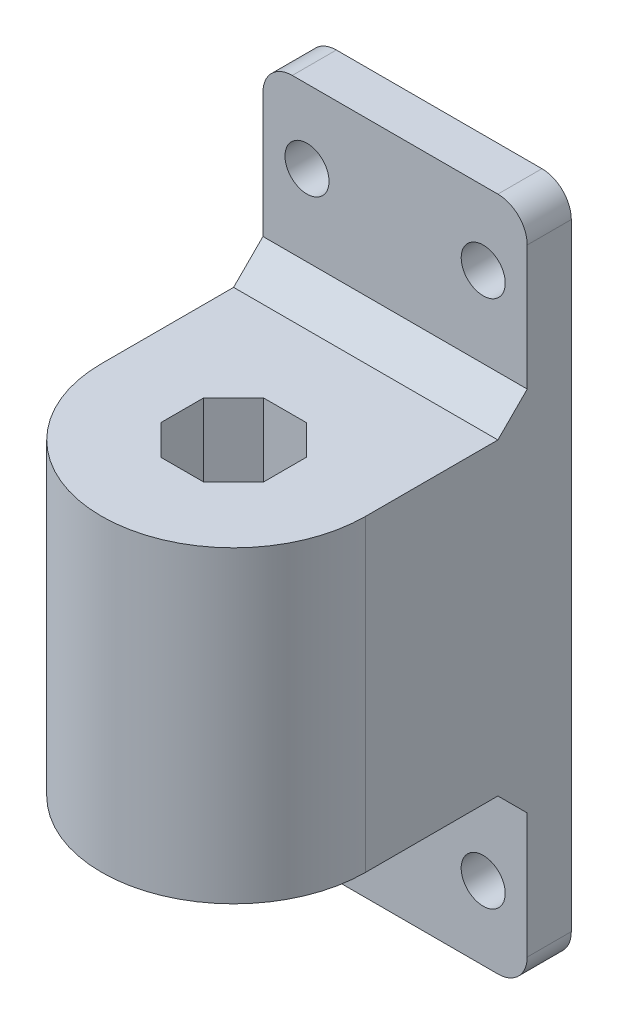
ISO-10303-21;
HEADER;
FILE_DESCRIPTION(('STEP AP214'),'2;1');
FILE_NAME('part.step','',(''),(''),'','','');
FILE_SCHEMA(('AUTOMOTIVE_DESIGN { 1 0 10303 214 1 1 1 1 }'));
ENDSEC;
DATA;
#1=APPLICATION_CONTEXT('core data for automotive mechanical design processes');
#2=APPLICATION_PROTOCOL_DEFINITION('international standard','automotive_design',2000,#1);
#3=PRODUCT_CONTEXT('',#1,'mechanical');
#4=PRODUCT('Part','Part','',(#3));
#5=PRODUCT_RELATED_PRODUCT_CATEGORY('part','',(#4));
#6=PRODUCT_DEFINITION_FORMATION('','',#4);
#7=PRODUCT_DEFINITION_CONTEXT('part definition',#1,'design');
#8=PRODUCT_DEFINITION('design','',#6,#7);
#9=PRODUCT_DEFINITION_SHAPE('','',#8);
#10=(LENGTH_UNIT() NAMED_UNIT(*) SI_UNIT(.MILLI.,.METRE.));
#11=(NAMED_UNIT(*) PLANE_ANGLE_UNIT() SI_UNIT($,.RADIAN.));
#12=(NAMED_UNIT(*) SI_UNIT($,.STERADIAN.) SOLID_ANGLE_UNIT());
#13=UNCERTAINTY_MEASURE_WITH_UNIT(LENGTH_MEASURE(1.E-05),#10,'distance_accuracy_value','');
#14=(GEOMETRIC_REPRESENTATION_CONTEXT(3) GLOBAL_UNCERTAINTY_ASSIGNED_CONTEXT((#13)) GLOBAL_UNIT_ASSIGNED_CONTEXT((#10,
#11,#12)) REPRESENTATION_CONTEXT('',''));
#15=CARTESIAN_POINT('',(0.,0.,0.));
#16=DIRECTION('',(0.,0.,1.));
#17=DIRECTION('',(1.,0.,0.));
#18=AXIS2_PLACEMENT_3D('',#15,#16,#17);
#19=CARTESIAN_POINT('',(0.,21.,14.));
#20=DIRECTION('',(0.,1.,0.));
#21=DIRECTION('',(0.,0.,1.));
#22=AXIS2_PLACEMENT_3D('',#19,#20,#21);
#23=PLANE('',#22);
#24=DIRECTION('',(-1.,0.,0.));
#25=VECTOR('',#24,1.);
#26=CARTESIAN_POINT('',(1.44974746830581,21.,10.5));
#27=LINE('',#26,#25);
#28=CARTESIAN_POINT('',(1.44974746830581,21.,10.5));
#29=VERTEX_POINT('',#28);
#30=CARTESIAN_POINT('',(-1.44974746830583,21.,10.5));
#31=VERTEX_POINT('',#30);
#32=EDGE_CURVE('E239',#29,#31,#27,.T.);
#33=ORIENTED_EDGE('',*,*,#32,.F.);
#34=DIRECTION('',(-0.707106781186552,0.,-0.707106781186543));
#35=VECTOR('',#34,1.);
#36=CARTESIAN_POINT('',(3.49999999999999,21.,12.5502525316942));
#37=LINE('',#36,#35);
#38=CARTESIAN_POINT('',(3.49999999999999,21.,12.5502525316942));
#39=VERTEX_POINT('',#38);
#40=EDGE_CURVE('E258',#39,#29,#37,.T.);
#41=ORIENTED_EDGE('',*,*,#40,.F.);
#42=DIRECTION('',(0.,0.,-1.));
#43=VECTOR('',#42,1.);
#44=CARTESIAN_POINT('',(3.5,21.,15.4497474683058));
#45=LINE('',#44,#43);
#46=CARTESIAN_POINT('',(3.5,21.,15.4497474683058));
#47=VERTEX_POINT('',#46);
#48=EDGE_CURVE('E255',#47,#39,#45,.T.);
#49=ORIENTED_EDGE('',*,*,#48,.F.);
#50=DIRECTION('',(0.707106781186546,0.,-0.707106781186549));
#51=VECTOR('',#50,1.);
#52=CARTESIAN_POINT('',(1.44974746830583,21.,17.5));
#53=LINE('',#52,#51);
#54=CARTESIAN_POINT('',(1.44974746830583,21.,17.5));
#55=VERTEX_POINT('',#54);
#56=EDGE_CURVE('E252',#55,#47,#53,.T.);
#57=ORIENTED_EDGE('',*,*,#56,.F.);
#58=DIRECTION('',(1.,0.,0.));
#59=VECTOR('',#58,1.);
#60=CARTESIAN_POINT('',(-1.44974746830584,21.,17.5));
#61=LINE('',#60,#59);
#62=CARTESIAN_POINT('',(-1.44974746830584,21.,17.5));
#63=VERTEX_POINT('',#62);
#64=EDGE_CURVE('E246',#63,#55,#61,.T.);
#65=ORIENTED_EDGE('',*,*,#64,.F.);
#66=DIRECTION('',(0.707106781186547,0.,0.707106781186548));
#67=VECTOR('',#66,1.);
#68=CARTESIAN_POINT('',(-3.5,21.,15.4497474683058));
#69=LINE('',#68,#67);
#70=CARTESIAN_POINT('',(-3.5,21.,15.4497474683058));
#71=VERTEX_POINT('',#70);
#72=EDGE_CURVE('E244',#71,#63,#69,.T.);
#73=ORIENTED_EDGE('',*,*,#72,.F.);
#74=DIRECTION('',(0.,0.,1.));
#75=VECTOR('',#74,1.);
#76=CARTESIAN_POINT('',(-3.5,21.,12.5502525316942));
#77=LINE('',#76,#75);
#78=CARTESIAN_POINT('',(-3.5,21.,12.5502525316942));
#79=VERTEX_POINT('',#78);
#80=EDGE_CURVE('E224',#79,#71,#77,.T.);
#81=ORIENTED_EDGE('',*,*,#80,.F.);
#82=DIRECTION('',(-0.707106781186547,0.,0.707106781186548));
#83=VECTOR('',#82,1.);
#84=CARTESIAN_POINT('',(-1.44974746830583,21.,10.5));
#85=LINE('',#84,#83);
#86=EDGE_CURVE('E233',#31,#79,#85,.T.);
#87=ORIENTED_EDGE('',*,*,#86,.F.);
#88=EDGE_LOOP('',(#33,#41,#49,#57,#65,#73,#81,#87));
#89=FACE_BOUND('',#88,.T.);
#90=DIRECTION('',(0.,0.,-1.));
#91=VECTOR('',#90,1.);
#92=CARTESIAN_POINT('',(9.,21.,14.));
#93=LINE('',#92,#91);
#94=CARTESIAN_POINT('',(9.,21.,14.));
#95=VERTEX_POINT('',#94);
#96=CARTESIAN_POINT('',(9.,21.,5.00000000000002));
#97=VERTEX_POINT('',#96);
#98=EDGE_CURVE('E327',#95,#97,#93,.T.);
#99=ORIENTED_EDGE('',*,*,#98,.T.);
#100=DIRECTION('',(-1.,0.,0.));
#101=VECTOR('',#100,1.);
#102=CARTESIAN_POINT('',(-9.,21.,5.00000000000002));
#103=LINE('',#102,#101);
#104=CARTESIAN_POINT('',(-9.,21.,5.00000000000002));
#105=VERTEX_POINT('',#104);
#106=EDGE_CURVE('E387',#97,#105,#103,.T.);
#107=ORIENTED_EDGE('',*,*,#106,.T.);
#108=DIRECTION('',(0.,0.,1.));
#109=VECTOR('',#108,1.);
#110=CARTESIAN_POINT('',(-9.,21.,0.));
#111=LINE('',#110,#109);
#112=CARTESIAN_POINT('',(-9.,21.,14.));
#113=VERTEX_POINT('',#112);
#114=EDGE_CURVE('E322',#105,#113,#111,.T.);
#115=ORIENTED_EDGE('',*,*,#114,.T.);
#116=CARTESIAN_POINT('',(0.,21.,14.));
#117=DIRECTION('',(0.,1.,0.));
#118=DIRECTION('',(0.,0.,1.));
#119=AXIS2_PLACEMENT_3D('',#116,#117,#118);
#120=CIRCLE('',#119,9.);
#121=EDGE_CURVE('E324',#113,#95,#120,.T.);
#122=ORIENTED_EDGE('',*,*,#121,.T.);
#123=EDGE_LOOP('',(#99,#107,#115,#122));
#124=FACE_BOUND('',#123,.T.);
#125=ADVANCED_FACE('F34',(#89,#124),#23,.T.);
#126=CARTESIAN_POINT('',(2.74241377865073,21.,9.24999999999999));
#127=DIRECTION('',(0.,0.,1.));
#128=DIRECTION('',(1.,0.,0.));
#129=AXIS2_PLACEMENT_3D('',#126,#127,#128);
#130=PLANE('',#129);
#131=DIRECTION('',(0.,-1.,0.));
#132=VECTOR('',#131,1.);
#133=CARTESIAN_POINT('',(2.74241377865073,21.,9.24999999999999));
#134=LINE('',#133,#132);
#135=CARTESIAN_POINT('',(2.74241377865073,4.00000000000001,9.24999999999999));
#136=VERTEX_POINT('',#135);
#137=CARTESIAN_POINT('',(2.74241377865072,0.,9.24999999999999));
#138=VERTEX_POINT('',#137);
#139=EDGE_CURVE('E309',#136,#138,#134,.T.);
#140=ORIENTED_EDGE('',*,*,#139,.F.);
#141=DIRECTION('',(-1.,0.,0.));
#142=VECTOR('',#141,1.);
#143=CARTESIAN_POINT('',(2.74241377865073,4.,9.24999999999999));
#144=LINE('',#143,#142);
#145=CARTESIAN_POINT('',(-2.74241377865072,4.,9.25));
#146=VERTEX_POINT('',#145);
#147=EDGE_CURVE('E288',#136,#146,#144,.T.);
#148=ORIENTED_EDGE('',*,*,#147,.T.);
#149=DIRECTION('',(0.,-1.,0.));
#150=VECTOR('',#149,1.);
#151=CARTESIAN_POINT('',(-2.74241377865072,21.,9.25));
#152=LINE('',#151,#150);
#153=CARTESIAN_POINT('',(-2.74241377865072,0.,9.25));
#154=VERTEX_POINT('',#153);
#155=EDGE_CURVE('E319',#146,#154,#152,.T.);
#156=ORIENTED_EDGE('',*,*,#155,.T.);
#157=DIRECTION('',(-1.,0.,0.));
#158=VECTOR('',#157,1.);
#159=CARTESIAN_POINT('',(2.74241377865073,0.,9.24999999999999));
#160=LINE('',#159,#158);
#161=EDGE_CURVE('E291',#138,#154,#160,.T.);
#162=ORIENTED_EDGE('',*,*,#161,.F.);
#163=EDGE_LOOP('',(#140,#148,#156,#162));
#164=FACE_BOUND('',#163,.T.);
#165=ADVANCED_FACE('F485',(#164),#130,.T.);
#166=CARTESIAN_POINT('',(-2.74241377865072,21.,9.25));
#167=DIRECTION('',(0.866025403784438,0.,0.5));
#168=DIRECTION('',(0.5,0.,-0.866025403784438));
#169=AXIS2_PLACEMENT_3D('',#166,#167,#168);
#170=PLANE('',#169);
#171=ORIENTED_EDGE('',*,*,#155,.F.);
#172=DIRECTION('',(-0.5,0.,0.866025403784438));
#173=VECTOR('',#172,1.);
#174=CARTESIAN_POINT('',(-2.74241377865072,4.,9.25));
#175=LINE('',#174,#173);
#176=CARTESIAN_POINT('',(-5.48482755730145,4.,14.));
#177=VERTEX_POINT('',#176);
#178=EDGE_CURVE('E285',#146,#177,#175,.T.);
#179=ORIENTED_EDGE('',*,*,#178,.T.);
#180=DIRECTION('',(0.,-1.,0.));
#181=VECTOR('',#180,1.);
#182=CARTESIAN_POINT('',(-5.48482755730145,21.,14.));
#183=LINE('',#182,#181);
#184=CARTESIAN_POINT('',(-5.48482755730145,0.,14.));
#185=VERTEX_POINT('',#184);
#186=EDGE_CURVE('E317',#177,#185,#183,.T.);
#187=ORIENTED_EDGE('',*,*,#186,.T.);
#188=DIRECTION('',(-0.5,0.,0.866025403784438));
#189=VECTOR('',#188,1.);
#190=CARTESIAN_POINT('',(-2.74241377865072,0.,9.25));
#191=LINE('',#190,#189);
#192=EDGE_CURVE('E294',#154,#185,#191,.T.);
#193=ORIENTED_EDGE('',*,*,#192,.F.);
#194=EDGE_LOOP('',(#171,#179,#187,#193));
#195=FACE_BOUND('',#194,.T.);
#196=ADVANCED_FACE('F490',(#195),#170,.T.);
#197=CARTESIAN_POINT('',(-5.48482755730145,21.,14.));
#198=DIRECTION('',(0.866025403784439,0.,-0.5));
#199=DIRECTION('',(-0.5,0.,-0.866025403784439));
#200=AXIS2_PLACEMENT_3D('',#197,#198,#199);
#201=PLANE('',#200);
#202=ORIENTED_EDGE('',*,*,#186,.F.);
#203=DIRECTION('',(0.5,0.,0.866025403784439));
#204=VECTOR('',#203,1.);
#205=CARTESIAN_POINT('',(-5.48482755730145,4.,14.));
#206=LINE('',#205,#204);
#207=CARTESIAN_POINT('',(-2.74241377865072,4.,18.75));
#208=VERTEX_POINT('',#207);
#209=EDGE_CURVE('E282',#177,#208,#206,.T.);
#210=ORIENTED_EDGE('',*,*,#209,.T.);
#211=DIRECTION('',(0.,-1.,0.));
#212=VECTOR('',#211,1.);
#213=CARTESIAN_POINT('',(-2.74241377865072,21.,18.75));
#214=LINE('',#213,#212);
#215=CARTESIAN_POINT('',(-2.74241377865072,0.,18.75));
#216=VERTEX_POINT('',#215);
#217=EDGE_CURVE('E315',#208,#216,#214,.T.);
#218=ORIENTED_EDGE('',*,*,#217,.T.);
#219=DIRECTION('',(0.5,0.,0.866025403784439));
#220=VECTOR('',#219,1.);
#221=CARTESIAN_POINT('',(-5.48482755730145,0.,14.));
#222=LINE('',#221,#220);
#223=EDGE_CURVE('E297',#185,#216,#222,.T.);
#224=ORIENTED_EDGE('',*,*,#223,.F.);
#225=EDGE_LOOP('',(#202,#210,#218,#224));
#226=FACE_BOUND('',#225,.T.);
#227=ADVANCED_FACE('F551',(#226),#201,.T.);
#228=CARTESIAN_POINT('',(-2.74241377865072,21.,18.75));
#229=DIRECTION('',(0.,0.,-1.));
#230=DIRECTION('',(-1.,0.,0.));
#231=AXIS2_PLACEMENT_3D('',#228,#229,#230);
#232=PLANE('',#231);
#233=ORIENTED_EDGE('',*,*,#217,.F.);
#234=DIRECTION('',(1.,0.,0.));
#235=VECTOR('',#234,1.);
#236=CARTESIAN_POINT('',(-2.74241377865072,4.,18.75));
#237=LINE('',#236,#235);
#238=CARTESIAN_POINT('',(2.74241377865073,4.,18.75));
#239=VERTEX_POINT('',#238);
#240=EDGE_CURVE('E279',#208,#239,#237,.T.);
#241=ORIENTED_EDGE('',*,*,#240,.T.);
#242=DIRECTION('',(0.,-1.,0.));
#243=VECTOR('',#242,1.);
#244=CARTESIAN_POINT('',(2.74241377865073,21.,18.75));
#245=LINE('',#244,#243);
#246=CARTESIAN_POINT('',(2.74241377865073,0.,18.75));
#247=VERTEX_POINT('',#246);
#248=EDGE_CURVE('E313',#239,#247,#245,.T.);
#249=ORIENTED_EDGE('',*,*,#248,.T.);
#250=DIRECTION('',(1.,0.,0.));
#251=VECTOR('',#250,1.);
#252=CARTESIAN_POINT('',(-2.74241377865072,0.,18.75));
#253=LINE('',#252,#251);
#254=EDGE_CURVE('E300',#216,#247,#253,.T.);
#255=ORIENTED_EDGE('',*,*,#254,.F.);
#256=EDGE_LOOP('',(#233,#241,#249,#255));
#257=FACE_BOUND('',#256,.T.);
#258=ADVANCED_FACE('F556',(#257),#232,.T.);
#259=CARTESIAN_POINT('',(2.74241377865073,21.,18.75));
#260=DIRECTION('',(-0.866025403784438,0.,-0.5));
#261=DIRECTION('',(-0.5,0.,0.866025403784439));
#262=AXIS2_PLACEMENT_3D('',#259,#260,#261);
#263=PLANE('',#262);
#264=ORIENTED_EDGE('',*,*,#248,.F.);
#265=DIRECTION('',(0.5,0.,-0.866025403784439));
#266=VECTOR('',#265,1.);
#267=CARTESIAN_POINT('',(2.74241377865073,4.,18.75));
#268=LINE('',#267,#266);
#269=CARTESIAN_POINT('',(5.48482755730145,4.,14.));
#270=VERTEX_POINT('',#269);
#271=EDGE_CURVE('E276',#239,#270,#268,.T.);
#272=ORIENTED_EDGE('',*,*,#271,.T.);
#273=DIRECTION('',(0.,-1.,0.));
#274=VECTOR('',#273,1.);
#275=CARTESIAN_POINT('',(5.48482755730145,21.,14.));
#276=LINE('',#275,#274);
#277=CARTESIAN_POINT('',(5.48482755730145,0.,14.));
#278=VERTEX_POINT('',#277);
#279=EDGE_CURVE('E311',#270,#278,#276,.T.);
#280=ORIENTED_EDGE('',*,*,#279,.T.);
#281=DIRECTION('',(0.5,0.,-0.866025403784438));
#282=VECTOR('',#281,1.);
#283=CARTESIAN_POINT('',(2.74241377865073,0.,18.75));
#284=LINE('',#283,#282);
#285=EDGE_CURVE('E303',#247,#278,#284,.T.);
#286=ORIENTED_EDGE('',*,*,#285,.F.);
#287=EDGE_LOOP('',(#264,#272,#280,#286));
#288=FACE_BOUND('',#287,.T.);
#289=ADVANCED_FACE('F559',(#288),#263,.T.);
#290=CARTESIAN_POINT('',(5.48482755730145,21.,14.));
#291=DIRECTION('',(-0.866025403784439,0.,0.5));
#292=DIRECTION('',(0.5,0.,0.866025403784439));
#293=AXIS2_PLACEMENT_3D('',#290,#291,#292);
#294=PLANE('',#293);
#295=ORIENTED_EDGE('',*,*,#279,.F.);
#296=DIRECTION('',(-0.5,0.,-0.866025403784439));
#297=VECTOR('',#296,1.);
#298=CARTESIAN_POINT('',(5.48482755730145,4.,14.));
#299=LINE('',#298,#297);
#300=EDGE_CURVE('E346',#270,#136,#299,.T.);
#301=ORIENTED_EDGE('',*,*,#300,.T.);
#302=ORIENTED_EDGE('',*,*,#139,.T.);
#303=DIRECTION('',(-0.5,0.,-0.866025403784439));
#304=VECTOR('',#303,1.);
#305=CARTESIAN_POINT('',(5.48482755730145,0.,14.));
#306=LINE('',#305,#304);
#307=EDGE_CURVE('E306',#278,#138,#306,.T.);
#308=ORIENTED_EDGE('',*,*,#307,.F.);
#309=EDGE_LOOP('',(#295,#301,#302,#308));
#310=FACE_BOUND('',#309,.T.);
#311=ADVANCED_FACE('F498',(#310),#294,.T.);
#312=CARTESIAN_POINT('',(0.,0.,14.));
#313=DIRECTION('',(0.,1.,0.));
#314=DIRECTION('',(0.,0.,1.));
#315=AXIS2_PLACEMENT_3D('',#312,#313,#314);
#316=PLANE('',#315);
#317=DIRECTION('',(0.,0.,1.));
#318=VECTOR('',#317,1.);
#319=CARTESIAN_POINT('',(-9.,0.,0.));
#320=LINE('',#319,#318);
#321=CARTESIAN_POINT('',(-9.,0.,5.00000000000002));
#322=VERTEX_POINT('',#321);
#323=CARTESIAN_POINT('',(-9.,0.,14.));
#324=VERTEX_POINT('',#323);
#325=EDGE_CURVE('E321',#322,#324,#320,.T.);
#326=ORIENTED_EDGE('',*,*,#325,.F.);
#327=DIRECTION('',(1.,0.,0.));
#328=VECTOR('',#327,1.);
#329=CARTESIAN_POINT('',(0.,0.,5.00000000000002));
#330=LINE('',#329,#328);
#331=CARTESIAN_POINT('',(9.,0.,5.00000000000002));
#332=VERTEX_POINT('',#331);
#333=EDGE_CURVE('E392',#322,#332,#330,.T.);
#334=ORIENTED_EDGE('',*,*,#333,.T.);
#335=DIRECTION('',(0.,0.,-1.));
#336=VECTOR('',#335,1.);
#337=CARTESIAN_POINT('',(9.,0.,14.));
#338=LINE('',#337,#336);
#339=CARTESIAN_POINT('',(9.,0.,14.));
#340=VERTEX_POINT('',#339);
#341=EDGE_CURVE('E325',#340,#332,#338,.T.);
#342=ORIENTED_EDGE('',*,*,#341,.F.);
#343=CARTESIAN_POINT('',(0.,0.,14.));
#344=DIRECTION('',(0.,1.,0.));
#345=DIRECTION('',(0.,0.,1.));
#346=AXIS2_PLACEMENT_3D('',#343,#344,#345);
#347=CIRCLE('',#346,9.);
#348=EDGE_CURVE('E332',#324,#340,#347,.T.);
#349=ORIENTED_EDGE('',*,*,#348,.F.);
#350=EDGE_LOOP('',(#326,#334,#342,#349));
#351=FACE_BOUND('',#350,.T.);
#352=ORIENTED_EDGE('',*,*,#161,.T.);
#353=ORIENTED_EDGE('',*,*,#192,.T.);
#354=ORIENTED_EDGE('',*,*,#223,.T.);
#355=ORIENTED_EDGE('',*,*,#254,.T.);
#356=ORIENTED_EDGE('',*,*,#285,.T.);
#357=ORIENTED_EDGE('',*,*,#307,.T.);
#358=EDGE_LOOP('',(#352,#353,#354,#355,#356,#357));
#359=FACE_BOUND('',#358,.T.);
#360=ADVANCED_FACE('F495',(#351,#359),#316,.F.);
#361=CARTESIAN_POINT('',(-9.,21.,0.));
#362=DIRECTION('',(1.,0.,0.));
#363=DIRECTION('',(0.,0.,-1.));
#364=AXIS2_PLACEMENT_3D('',#361,#362,#363);
#365=PLANE('',#364);
#366=DIRECTION('',(0.,-1.,0.));
#367=VECTOR('',#366,1.);
#368=CARTESIAN_POINT('',(-9.,21.,0.));
#369=LINE('',#368,#367);
#370=CARTESIAN_POINT('',(-9.,31.5,0.));
#371=VERTEX_POINT('',#370);
#372=CARTESIAN_POINT('',(-9.,-10.5,0.));
#373=VERTEX_POINT('',#372);
#374=EDGE_CURVE('E330',#371,#373,#369,.T.);
#375=ORIENTED_EDGE('',*,*,#374,.T.);
#376=DIRECTION('',(0.,0.,-1.));
#377=VECTOR('',#376,1.);
#378=CARTESIAN_POINT('',(-9.,-10.5,3.));
#379=LINE('',#378,#377);
#380=CARTESIAN_POINT('',(-9.,-10.5,3.));
#381=VERTEX_POINT('',#380);
#382=EDGE_CURVE('E375',#373,#381,#379,.F.);
#383=ORIENTED_EDGE('',*,*,#382,.T.);
#384=DIRECTION('',(0.,1.,0.));
#385=VECTOR('',#384,1.);
#386=CARTESIAN_POINT('',(-9.,0.,3.));
#387=LINE('',#386,#385);
#388=CARTESIAN_POINT('',(-9.,-1.99999999999999,3.));
#389=VERTEX_POINT('',#388);
#390=EDGE_CURVE('E538',#381,#389,#387,.T.);
#391=ORIENTED_EDGE('',*,*,#390,.T.);
#392=DIRECTION('',(0.,0.707106781186544,0.707106781186551));
#393=VECTOR('',#392,1.);
#394=CARTESIAN_POINT('',(-9.,7.99999999999988,13.));
#395=LINE('',#394,#393);
#396=EDGE_CURVE('E12',#389,#322,#395,.T.);
#397=ORIENTED_EDGE('',*,*,#396,.T.);
#398=ORIENTED_EDGE('',*,*,#325,.T.);
#399=DIRECTION('',(0.,-1.,0.));
#400=VECTOR('',#399,1.);
#401=CARTESIAN_POINT('',(-9.,21.,14.));
#402=LINE('',#401,#400);
#403=EDGE_CURVE('E343',#113,#324,#402,.T.);
#404=ORIENTED_EDGE('',*,*,#403,.F.);
#405=ORIENTED_EDGE('',*,*,#114,.F.);
#406=DIRECTION('',(0.,-0.707106781186542,0.707106781186553));
#407=VECTOR('',#406,1.);
#408=CARTESIAN_POINT('',(-9.,23.5,2.49999999999997));
#409=LINE('',#408,#407);
#410=CARTESIAN_POINT('',(-9.,23.,3.));
#411=VERTEX_POINT('',#410);
#412=EDGE_CURVE('E396',#105,#411,#409,.F.);
#413=ORIENTED_EDGE('',*,*,#412,.T.);
#414=DIRECTION('',(0.,1.,0.));
#415=VECTOR('',#414,1.);
#416=CARTESIAN_POINT('',(-9.,21.,3.));
#417=LINE('',#416,#415);
#418=CARTESIAN_POINT('',(-8.99999999999999,31.5,3.));
#419=VERTEX_POINT('',#418);
#420=EDGE_CURVE('E415',#411,#419,#417,.T.);
#421=ORIENTED_EDGE('',*,*,#420,.T.);
#422=DIRECTION('',(0.,0.,-1.));
#423=VECTOR('',#422,1.);
#424=CARTESIAN_POINT('',(-9.,31.5,0.));
#425=LINE('',#424,#423);
#426=EDGE_CURVE('E372',#419,#371,#425,.T.);
#427=ORIENTED_EDGE('',*,*,#426,.T.);
#428=EDGE_LOOP('',(#375,#383,#391,#397,#398,#404,#405,#413,#421,#427));
#429=FACE_BOUND('',#428,.T.);
#430=ADVANCED_FACE('F414',(#429),#365,.F.);
#431=CARTESIAN_POINT('',(0.,21.,14.));
#432=DIRECTION('',(0.,-1.,0.));
#433=DIRECTION('',(0.,0.,-1.));
#434=AXIS2_PLACEMENT_3D('',#431,#432,#433);
#435=CYLINDRICAL_SURFACE('',#434,9.);
#436=ORIENTED_EDGE('',*,*,#403,.T.);
#437=ORIENTED_EDGE('',*,*,#348,.T.);
#438=DIRECTION('',(0.,-1.,0.));
#439=VECTOR('',#438,1.);
#440=CARTESIAN_POINT('',(9.,21.,14.));
#441=LINE('',#440,#439);
#442=EDGE_CURVE('E341',#95,#340,#441,.T.);
#443=ORIENTED_EDGE('',*,*,#442,.F.);
#444=ORIENTED_EDGE('',*,*,#121,.F.);
#445=EDGE_LOOP('',(#436,#437,#443,#444));
#446=FACE_BOUND('',#445,.T.);
#447=ADVANCED_FACE('F506',(#446),#435,.T.);
#448=CARTESIAN_POINT('',(9.,21.,14.));
#449=DIRECTION('',(-1.,0.,0.));
#450=DIRECTION('',(0.,0.,1.));
#451=AXIS2_PLACEMENT_3D('',#448,#449,#450);
#452=PLANE('',#451);
#453=ORIENTED_EDGE('',*,*,#341,.T.);
#454=DIRECTION('',(0.,-0.707106781186544,-0.707106781186551));
#455=VECTOR('',#454,1.);
#456=CARTESIAN_POINT('',(9.,14.9999999999999,20.0000000000001));
#457=LINE('',#456,#455);
#458=CARTESIAN_POINT('',(9.,-1.99999999999999,3.));
#459=VERTEX_POINT('',#458);
#460=EDGE_CURVE('E42',#332,#459,#457,.T.);
#461=ORIENTED_EDGE('',*,*,#460,.T.);
#462=DIRECTION('',(0.,-1.,0.));
#463=VECTOR('',#462,1.);
#464=CARTESIAN_POINT('',(9.,0.,3.));
#465=LINE('',#464,#463);
#466=CARTESIAN_POINT('',(9.,-10.5,3.));
#467=VERTEX_POINT('',#466);
#468=EDGE_CURVE('E817',#459,#467,#465,.T.);
#469=ORIENTED_EDGE('',*,*,#468,.T.);
#470=DIRECTION('',(0.,0.,-1.));
#471=VECTOR('',#470,1.);
#472=CARTESIAN_POINT('',(9.,-10.5,0.));
#473=LINE('',#472,#471);
#474=CARTESIAN_POINT('',(9.,-10.5,0.));
#475=VERTEX_POINT('',#474);
#476=EDGE_CURVE('E351',#467,#475,#473,.T.);
#477=ORIENTED_EDGE('',*,*,#476,.T.);
#478=DIRECTION('',(0.,-1.,0.));
#479=VECTOR('',#478,1.);
#480=CARTESIAN_POINT('',(9.,21.,0.));
#481=LINE('',#480,#479);
#482=CARTESIAN_POINT('',(9.,31.5,0.));
#483=VERTEX_POINT('',#482);
#484=EDGE_CURVE('E338',#483,#475,#481,.T.);
#485=ORIENTED_EDGE('',*,*,#484,.F.);
#486=DIRECTION('',(0.,0.,-1.));
#487=VECTOR('',#486,1.);
#488=CARTESIAN_POINT('',(9.,31.5,3.));
#489=LINE('',#488,#487);
#490=CARTESIAN_POINT('',(9.,31.5,3.));
#491=VERTEX_POINT('',#490);
#492=EDGE_CURVE('E349',#483,#491,#489,.F.);
#493=ORIENTED_EDGE('',*,*,#492,.T.);
#494=DIRECTION('',(0.,-1.,0.));
#495=VECTOR('',#494,1.);
#496=CARTESIAN_POINT('',(9.,21.,3.));
#497=LINE('',#496,#495);
#498=CARTESIAN_POINT('',(9.,23.,3.));
#499=VERTEX_POINT('',#498);
#500=EDGE_CURVE('E404',#491,#499,#497,.T.);
#501=ORIENTED_EDGE('',*,*,#500,.T.);
#502=DIRECTION('',(0.,0.707106781186543,-0.707106781186553));
#503=VECTOR('',#502,1.);
#504=CARTESIAN_POINT('',(9.,16.5,9.50000000000007));
#505=LINE('',#504,#503);
#506=EDGE_CURVE('E398',#499,#97,#505,.F.);
#507=ORIENTED_EDGE('',*,*,#506,.T.);
#508=ORIENTED_EDGE('',*,*,#98,.F.);
#509=ORIENTED_EDGE('',*,*,#442,.T.);
#510=EDGE_LOOP('',(#453,#461,#469,#477,#485,#493,#501,#507,#508,#509));
#511=FACE_BOUND('',#510,.T.);
#512=ADVANCED_FACE('F402',(#511),#452,.F.);
#513=CARTESIAN_POINT('',(-9.,21.,0.));
#514=DIRECTION('',(0.,0.,1.));
#515=DIRECTION('',(1.,0.,0.));
#516=AXIS2_PLACEMENT_3D('',#513,#514,#515);
#517=PLANE('',#516);
#518=ORIENTED_EDGE('',*,*,#484,.T.);
#519=CARTESIAN_POINT('',(7.,-10.5,0.));
#520=DIRECTION('',(0.,0.,1.));
#521=DIRECTION('',(1.,0.,0.));
#522=AXIS2_PLACEMENT_3D('',#519,#520,#521);
#523=CIRCLE('',#522,2.);
#524=CARTESIAN_POINT('',(7.,-12.5,0.));
#525=VERTEX_POINT('',#524);
#526=EDGE_CURVE('E360',#475,#525,#523,.F.);
#527=ORIENTED_EDGE('',*,*,#526,.T.);
#528=DIRECTION('',(-1.,0.,0.));
#529=VECTOR('',#528,1.);
#530=CARTESIAN_POINT('',(9.,-12.5,0.));
#531=LINE('',#530,#529);
#532=CARTESIAN_POINT('',(-7.,-12.5,0.));
#533=VERTEX_POINT('',#532);
#534=EDGE_CURVE('E822',#525,#533,#531,.T.);
#535=ORIENTED_EDGE('',*,*,#534,.T.);
#536=CARTESIAN_POINT('',(-7.,-10.5,0.));
#537=DIRECTION('',(0.,0.,1.));
#538=DIRECTION('',(1.,0.,0.));
#539=AXIS2_PLACEMENT_3D('',#536,#537,#538);
#540=CIRCLE('',#539,2.);
#541=EDGE_CURVE('E358',#533,#373,#540,.F.);
#542=ORIENTED_EDGE('',*,*,#541,.T.);
#543=ORIENTED_EDGE('',*,*,#374,.F.);
#544=CARTESIAN_POINT('',(-7.,31.5,0.));
#545=DIRECTION('',(0.,0.,1.));
#546=DIRECTION('',(1.,0.,0.));
#547=AXIS2_PLACEMENT_3D('',#544,#545,#546);
#548=CIRCLE('',#547,2.);
#549=CARTESIAN_POINT('',(-7.,33.5,0.));
#550=VERTEX_POINT('',#549);
#551=EDGE_CURVE('E354',#371,#550,#548,.F.);
#552=ORIENTED_EDGE('',*,*,#551,.T.);
#553=DIRECTION('',(1.,0.,0.));
#554=VECTOR('',#553,1.);
#555=CARTESIAN_POINT('',(9.,33.5,0.));
#556=LINE('',#555,#554);
#557=CARTESIAN_POINT('',(7.,33.5,0.));
#558=VERTEX_POINT('',#557);
#559=EDGE_CURVE('E426',#550,#558,#556,.T.);
#560=ORIENTED_EDGE('',*,*,#559,.T.);
#561=CARTESIAN_POINT('',(7.,31.5,0.));
#562=DIRECTION('',(0.,0.,1.));
#563=DIRECTION('',(1.,0.,0.));
#564=AXIS2_PLACEMENT_3D('',#561,#562,#563);
#565=CIRCLE('',#564,2.);
#566=EDGE_CURVE('E356',#558,#483,#565,.F.);
#567=ORIENTED_EDGE('',*,*,#566,.T.);
#568=EDGE_LOOP('',(#518,#527,#535,#542,#543,#552,#560,#567));
#569=FACE_BOUND('',#568,.T.);
#570=CARTESIAN_POINT('',(-6.,28.5,0.));
#571=DIRECTION('',(0.,0.,-1.));
#572=DIRECTION('',(-1.,0.,0.));
#573=AXIS2_PLACEMENT_3D('',#570,#571,#572);
#574=CIRCLE('',#573,1.5);
#575=CARTESIAN_POINT('',(-7.49999999999999,28.5,0.));
#576=VERTEX_POINT('',#575);
#577=EDGE_CURVE('E832',#576,#576,#574,.T.);
#578=ORIENTED_EDGE('',*,*,#577,.F.);
#579=EDGE_LOOP('',(#578));
#580=FACE_BOUND('',#579,.T.);
#581=CARTESIAN_POINT('',(6.,28.5,0.));
#582=DIRECTION('',(0.,0.,-1.));
#583=DIRECTION('',(-1.,0.,0.));
#584=AXIS2_PLACEMENT_3D('',#581,#582,#583);
#585=CIRCLE('',#584,1.5);
#586=CARTESIAN_POINT('',(4.5,28.5,0.));
#587=VERTEX_POINT('',#586);
#588=EDGE_CURVE('E837',#587,#587,#585,.T.);
#589=ORIENTED_EDGE('',*,*,#588,.F.);
#590=EDGE_LOOP('',(#589));
#591=FACE_BOUND('',#590,.T.);
#592=CARTESIAN_POINT('',(6.,-7.49999999999999,0.));
#593=DIRECTION('',(0.,0.,-1.));
#594=DIRECTION('',(1.,0.,0.));
#595=AXIS2_PLACEMENT_3D('',#592,#593,#594);
#596=CIRCLE('',#595,1.5);
#597=CARTESIAN_POINT('',(7.5,-7.49999999999999,0.));
#598=VERTEX_POINT('',#597);
#599=EDGE_CURVE('E849',#598,#598,#596,.T.);
#600=ORIENTED_EDGE('',*,*,#599,.F.);
#601=EDGE_LOOP('',(#600));
#602=FACE_BOUND('',#601,.T.);
#603=CARTESIAN_POINT('',(-6.,-7.49999999999999,0.));
#604=DIRECTION('',(0.,0.,-1.));
#605=DIRECTION('',(1.,0.,0.));
#606=AXIS2_PLACEMENT_3D('',#603,#604,#605);
#607=CIRCLE('',#606,1.5);
#608=CARTESIAN_POINT('',(-4.5,-7.49999999999999,0.));
#609=VERTEX_POINT('',#608);
#610=EDGE_CURVE('E829',#609,#609,#607,.T.);
#611=ORIENTED_EDGE('',*,*,#610,.F.);
#612=EDGE_LOOP('',(#611));
#613=FACE_BOUND('',#612,.T.);
#614=ADVANCED_FACE('F500',(#569,#580,#591,#602,#613),#517,.F.);
#615=CARTESIAN_POINT('',(-1.44974746830583,-25.4558441227157,10.5));
#616=DIRECTION('',(-0.707106781186548,0.,-0.707106781186548));
#617=DIRECTION('',(-0.707106781186548,0.,0.707106781186548));
#618=AXIS2_PLACEMENT_3D('',#615,#616,#617);
#619=PLANE('',#618);
#620=DIRECTION('',(0.,1.,0.));
#621=VECTOR('',#620,1.);
#622=CARTESIAN_POINT('',(-3.5,-25.4558441227157,12.5502525316942));
#623=LINE('',#622,#621);
#624=CARTESIAN_POINT('',(-3.5,4.,12.5502525316942));
#625=VERTEX_POINT('',#624);
#626=EDGE_CURVE('E219',#625,#79,#623,.T.);
#627=ORIENTED_EDGE('',*,*,#626,.F.);
#628=DIRECTION('',(0.707106781186548,0.,-0.707106781186548));
#629=VECTOR('',#628,1.);
#630=CARTESIAN_POINT('',(-1.44974746830583,4.,10.5));
#631=LINE('',#630,#629);
#632=CARTESIAN_POINT('',(-1.44974746830583,4.,10.5));
#633=VERTEX_POINT('',#632);
#634=EDGE_CURVE('E263',#625,#633,#631,.T.);
#635=ORIENTED_EDGE('',*,*,#634,.T.);
#636=DIRECTION('',(0.,1.,0.));
#637=VECTOR('',#636,1.);
#638=CARTESIAN_POINT('',(-1.44974746830583,-25.4558441227157,10.5));
#639=LINE('',#638,#637);
#640=EDGE_CURVE('E230',#633,#31,#639,.T.);
#641=ORIENTED_EDGE('',*,*,#640,.T.);
#642=ORIENTED_EDGE('',*,*,#86,.T.);
#643=EDGE_LOOP('',(#627,#635,#641,#642));
#644=FACE_BOUND('',#643,.T.);
#645=ADVANCED_FACE('F234',(#644),#619,.F.);
#646=CARTESIAN_POINT('',(-3.5,-25.4558441227157,12.5502525316942));
#647=DIRECTION('',(-1.,0.,0.));
#648=DIRECTION('',(0.,0.,1.));
#649=AXIS2_PLACEMENT_3D('',#646,#647,#648);
#650=PLANE('',#649);
#651=DIRECTION('',(0.,1.,0.));
#652=VECTOR('',#651,1.);
#653=CARTESIAN_POINT('',(-3.5,-25.4558441227157,15.4497474683058));
#654=LINE('',#653,#652);
#655=CARTESIAN_POINT('',(-3.5,4.,15.4497474683058));
#656=VERTEX_POINT('',#655);
#657=EDGE_CURVE('E229',#656,#71,#654,.T.);
#658=ORIENTED_EDGE('',*,*,#657,.F.);
#659=DIRECTION('',(0.,0.,-1.));
#660=VECTOR('',#659,1.);
#661=CARTESIAN_POINT('',(-3.5,4.,12.5502525316942));
#662=LINE('',#661,#660);
#663=EDGE_CURVE('E226',#656,#625,#662,.T.);
#664=ORIENTED_EDGE('',*,*,#663,.T.);
#665=ORIENTED_EDGE('',*,*,#626,.T.);
#666=ORIENTED_EDGE('',*,*,#80,.T.);
#667=EDGE_LOOP('',(#658,#664,#665,#666));
#668=FACE_BOUND('',#667,.T.);
#669=ADVANCED_FACE('F222',(#668),#650,.F.);
#670=CARTESIAN_POINT('',(-3.5,-25.4558441227157,15.4497474683058));
#671=DIRECTION('',(-0.707106781186548,0.,0.707106781186547));
#672=DIRECTION('',(0.707106781186547,0.,0.707106781186548));
#673=AXIS2_PLACEMENT_3D('',#670,#671,#672);
#674=PLANE('',#673);
#675=DIRECTION('',(0.,1.,0.));
#676=VECTOR('',#675,1.);
#677=CARTESIAN_POINT('',(-1.44974746830584,-25.4558441227157,17.5));
#678=LINE('',#677,#676);
#679=CARTESIAN_POINT('',(-1.44974746830584,4.,17.5));
#680=VERTEX_POINT('',#679);
#681=EDGE_CURVE('E270',#680,#63,#678,.T.);
#682=ORIENTED_EDGE('',*,*,#681,.F.);
#683=DIRECTION('',(-0.707106781186547,0.,-0.707106781186548));
#684=VECTOR('',#683,1.);
#685=CARTESIAN_POINT('',(-3.5,4.,15.4497474683058));
#686=LINE('',#685,#684);
#687=EDGE_CURVE('E434',#680,#656,#686,.T.);
#688=ORIENTED_EDGE('',*,*,#687,.T.);
#689=ORIENTED_EDGE('',*,*,#657,.T.);
#690=ORIENTED_EDGE('',*,*,#72,.T.);
#691=EDGE_LOOP('',(#682,#688,#689,#690));
#692=FACE_BOUND('',#691,.T.);
#693=ADVANCED_FACE('F469',(#692),#674,.F.);
#694=CARTESIAN_POINT('',(-1.44974746830584,-25.4558441227157,17.5));
#695=DIRECTION('',(0.,0.,1.));
#696=DIRECTION('',(1.,0.,0.));
#697=AXIS2_PLACEMENT_3D('',#694,#695,#696);
#698=PLANE('',#697);
#699=DIRECTION('',(0.,1.,0.));
#700=VECTOR('',#699,1.);
#701=CARTESIAN_POINT('',(1.44974746830583,-25.4558441227157,17.5));
#702=LINE('',#701,#700);
#703=CARTESIAN_POINT('',(1.44974746830583,4.,17.5));
#704=VERTEX_POINT('',#703);
#705=EDGE_CURVE('E268',#704,#55,#702,.T.);
#706=ORIENTED_EDGE('',*,*,#705,.F.);
#707=DIRECTION('',(-1.,0.,0.));
#708=VECTOR('',#707,1.);
#709=CARTESIAN_POINT('',(-1.44974746830584,4.,17.5));
#710=LINE('',#709,#708);
#711=EDGE_CURVE('E437',#704,#680,#710,.T.);
#712=ORIENTED_EDGE('',*,*,#711,.T.);
#713=ORIENTED_EDGE('',*,*,#681,.T.);
#714=ORIENTED_EDGE('',*,*,#64,.T.);
#715=EDGE_LOOP('',(#706,#712,#713,#714));
#716=FACE_BOUND('',#715,.T.);
#717=ADVANCED_FACE('F466',(#716),#698,.F.);
#718=CARTESIAN_POINT('',(1.44974746830583,-25.4558441227157,17.5));
#719=DIRECTION('',(0.707106781186549,0.,0.707106781186546));
#720=DIRECTION('',(0.707106781186546,0.,-0.707106781186549));
#721=AXIS2_PLACEMENT_3D('',#718,#719,#720);
#722=PLANE('',#721);
#723=DIRECTION('',(0.,1.,0.));
#724=VECTOR('',#723,1.);
#725=CARTESIAN_POINT('',(3.5,-25.4558441227157,15.4497474683058));
#726=LINE('',#725,#724);
#727=CARTESIAN_POINT('',(3.5,4.,15.4497474683058));
#728=VERTEX_POINT('',#727);
#729=EDGE_CURVE('E266',#728,#47,#726,.T.);
#730=ORIENTED_EDGE('',*,*,#729,.F.);
#731=DIRECTION('',(-0.707106781186546,0.,0.707106781186549));
#732=VECTOR('',#731,1.);
#733=CARTESIAN_POINT('',(1.44974746830583,4.,17.5));
#734=LINE('',#733,#732);
#735=EDGE_CURVE('E440',#728,#704,#734,.T.);
#736=ORIENTED_EDGE('',*,*,#735,.T.);
#737=ORIENTED_EDGE('',*,*,#705,.T.);
#738=ORIENTED_EDGE('',*,*,#56,.T.);
#739=EDGE_LOOP('',(#730,#736,#737,#738));
#740=FACE_BOUND('',#739,.T.);
#741=ADVANCED_FACE('F463',(#740),#722,.F.);
#742=CARTESIAN_POINT('',(3.5,-25.4558441227157,15.4497474683058));
#743=DIRECTION('',(1.,0.,0.));
#744=DIRECTION('',(0.,0.,-1.));
#745=AXIS2_PLACEMENT_3D('',#742,#743,#744);
#746=PLANE('',#745);
#747=DIRECTION('',(0.,1.,0.));
#748=VECTOR('',#747,1.);
#749=CARTESIAN_POINT('',(3.49999999999999,-25.4558441227157,12.5502525316942));
#750=LINE('',#749,#748);
#751=CARTESIAN_POINT('',(3.49999999999999,4.,12.5502525316942));
#752=VERTEX_POINT('',#751);
#753=EDGE_CURVE('E264',#752,#39,#750,.T.);
#754=ORIENTED_EDGE('',*,*,#753,.F.);
#755=DIRECTION('',(0.,0.,1.));
#756=VECTOR('',#755,1.);
#757=CARTESIAN_POINT('',(3.5,4.,15.4497474683058));
#758=LINE('',#757,#756);
#759=EDGE_CURVE('E443',#752,#728,#758,.T.);
#760=ORIENTED_EDGE('',*,*,#759,.T.);
#761=ORIENTED_EDGE('',*,*,#729,.T.);
#762=ORIENTED_EDGE('',*,*,#48,.T.);
#763=EDGE_LOOP('',(#754,#760,#761,#762));
#764=FACE_BOUND('',#763,.T.);
#765=ADVANCED_FACE('F460',(#764),#746,.F.);
#766=CARTESIAN_POINT('',(3.49999999999999,-25.4558441227157,12.5502525316942));
#767=DIRECTION('',(0.707106781186543,0.,-0.707106781186552));
#768=DIRECTION('',(-0.707106781186552,0.,-0.707106781186543));
#769=AXIS2_PLACEMENT_3D('',#766,#767,#768);
#770=PLANE('',#769);
#771=DIRECTION('',(0.,1.,0.));
#772=VECTOR('',#771,1.);
#773=CARTESIAN_POINT('',(1.44974746830581,-25.4558441227157,10.5));
#774=LINE('',#773,#772);
#775=CARTESIAN_POINT('',(1.44974746830581,4.,10.5));
#776=VERTEX_POINT('',#775);
#777=EDGE_CURVE('E261',#776,#29,#774,.T.);
#778=ORIENTED_EDGE('',*,*,#777,.F.);
#779=DIRECTION('',(0.707106781186552,0.,0.707106781186543));
#780=VECTOR('',#779,1.);
#781=CARTESIAN_POINT('',(3.49999999999999,4.,12.5502525316942));
#782=LINE('',#781,#780);
#783=EDGE_CURVE('E446',#776,#752,#782,.T.);
#784=ORIENTED_EDGE('',*,*,#783,.T.);
#785=ORIENTED_EDGE('',*,*,#753,.T.);
#786=ORIENTED_EDGE('',*,*,#40,.T.);
#787=EDGE_LOOP('',(#778,#784,#785,#786));
#788=FACE_BOUND('',#787,.T.);
#789=ADVANCED_FACE('F457',(#788),#770,.F.);
#790=CARTESIAN_POINT('',(1.44974746830581,-25.4558441227157,10.5));
#791=DIRECTION('',(0.,0.,-1.));
#792=DIRECTION('',(-1.,0.,0.));
#793=AXIS2_PLACEMENT_3D('',#790,#791,#792);
#794=PLANE('',#793);
#795=ORIENTED_EDGE('',*,*,#640,.F.);
#796=DIRECTION('',(1.,0.,0.));
#797=VECTOR('',#796,1.);
#798=CARTESIAN_POINT('',(1.44974746830581,4.,10.5));
#799=LINE('',#798,#797);
#800=EDGE_CURVE('E275',#633,#776,#799,.T.);
#801=ORIENTED_EDGE('',*,*,#800,.T.);
#802=ORIENTED_EDGE('',*,*,#777,.T.);
#803=ORIENTED_EDGE('',*,*,#32,.T.);
#804=EDGE_LOOP('',(#795,#801,#802,#803));
#805=FACE_BOUND('',#804,.T.);
#806=ADVANCED_FACE('F451',(#805),#794,.F.);
#807=CARTESIAN_POINT('',(0.,4.,14.));
#808=DIRECTION('',(0.,1.,0.));
#809=DIRECTION('',(0.,0.,1.));
#810=AXIS2_PLACEMENT_3D('',#807,#808,#809);
#811=PLANE('',#810);
#812=ORIENTED_EDGE('',*,*,#147,.F.);
#813=ORIENTED_EDGE('',*,*,#300,.F.);
#814=ORIENTED_EDGE('',*,*,#271,.F.);
#815=ORIENTED_EDGE('',*,*,#240,.F.);
#816=ORIENTED_EDGE('',*,*,#209,.F.);
#817=ORIENTED_EDGE('',*,*,#178,.F.);
#818=EDGE_LOOP('',(#812,#813,#814,#815,#816,#817));
#819=FACE_BOUND('',#818,.T.);
#820=ORIENTED_EDGE('',*,*,#634,.F.);
#821=ORIENTED_EDGE('',*,*,#663,.F.);
#822=ORIENTED_EDGE('',*,*,#687,.F.);
#823=ORIENTED_EDGE('',*,*,#711,.F.);
#824=ORIENTED_EDGE('',*,*,#735,.F.);
#825=ORIENTED_EDGE('',*,*,#759,.F.);
#826=ORIENTED_EDGE('',*,*,#783,.F.);
#827=ORIENTED_EDGE('',*,*,#800,.F.);
#828=EDGE_LOOP('',(#820,#821,#822,#823,#824,#825,#826,#827));
#829=FACE_BOUND('',#828,.T.);
#830=ADVANCED_FACE('F471',(#819,#829),#811,.F.);
#831=CARTESIAN_POINT('',(9.,33.5,3.));
#832=DIRECTION('',(0.,1.,0.));
#833=DIRECTION('',(0.,0.,1.));
#834=AXIS2_PLACEMENT_3D('',#831,#832,#833);
#835=PLANE('',#834);
#836=DIRECTION('',(1.,0.,0.));
#837=VECTOR('',#836,1.);
#838=CARTESIAN_POINT('',(9.,33.5,3.));
#839=LINE('',#838,#837);
#840=CARTESIAN_POINT('',(-7.,33.5,3.));
#841=VERTEX_POINT('',#840);
#842=CARTESIAN_POINT('',(7.,33.5,3.));
#843=VERTEX_POINT('',#842);
#844=EDGE_CURVE('E422',#841,#843,#839,.T.);
#845=ORIENTED_EDGE('',*,*,#844,.T.);
#846=DIRECTION('',(0.,0.,-1.));
#847=VECTOR('',#846,1.);
#848=CARTESIAN_POINT('',(7.,33.5,0.));
#849=LINE('',#848,#847);
#850=EDGE_CURVE('E379',#843,#558,#849,.T.);
#851=ORIENTED_EDGE('',*,*,#850,.T.);
#852=ORIENTED_EDGE('',*,*,#559,.F.);
#853=DIRECTION('',(0.,0.,-1.));
#854=VECTOR('',#853,1.);
#855=CARTESIAN_POINT('',(-7.,33.5,3.));
#856=LINE('',#855,#854);
#857=EDGE_CURVE('E377',#550,#841,#856,.F.);
#858=ORIENTED_EDGE('',*,*,#857,.T.);
#859=EDGE_LOOP('',(#845,#851,#852,#858));
#860=FACE_BOUND('',#859,.T.);
#861=ADVANCED_FACE('F473',(#860),#835,.T.);
#862=CARTESIAN_POINT('',(0.,0.,3.));
#863=DIRECTION('',(0.,0.,1.));
#864=DIRECTION('',(1.,0.,0.));
#865=AXIS2_PLACEMENT_3D('',#862,#863,#864);
#866=PLANE('',#865);
#867=CARTESIAN_POINT('',(-6.,28.5,3.));
#868=DIRECTION('',(0.,0.,-1.));
#869=DIRECTION('',(-1.,0.,0.));
#870=AXIS2_PLACEMENT_3D('',#867,#868,#869);
#871=CIRCLE('',#870,1.5);
#872=CARTESIAN_POINT('',(-7.49999999999999,28.5,3.));
#873=VERTEX_POINT('',#872);
#874=EDGE_CURVE('E834',#873,#873,#871,.T.);
#875=ORIENTED_EDGE('',*,*,#874,.T.);
#876=EDGE_LOOP('',(#875));
#877=FACE_BOUND('',#876,.T.);
#878=CARTESIAN_POINT('',(6.,28.5,3.));
#879=DIRECTION('',(0.,0.,-1.));
#880=DIRECTION('',(-1.,0.,0.));
#881=AXIS2_PLACEMENT_3D('',#878,#879,#880);
#882=CIRCLE('',#881,1.5);
#883=CARTESIAN_POINT('',(4.5,28.5,3.));
#884=VERTEX_POINT('',#883);
#885=EDGE_CURVE('E432',#884,#884,#882,.T.);
#886=ORIENTED_EDGE('',*,*,#885,.T.);
#887=EDGE_LOOP('',(#886));
#888=FACE_BOUND('',#887,.T.);
#889=ORIENTED_EDGE('',*,*,#420,.F.);
#890=DIRECTION('',(1.,0.,0.));
#891=VECTOR('',#890,1.);
#892=CARTESIAN_POINT('',(9.,23.,3.));
#893=LINE('',#892,#891);
#894=EDGE_CURVE('E390',#411,#499,#893,.T.);
#895=ORIENTED_EDGE('',*,*,#894,.T.);
#896=ORIENTED_EDGE('',*,*,#500,.F.);
#897=CARTESIAN_POINT('',(7.,31.5,3.));
#898=DIRECTION('',(0.,0.,1.));
#899=DIRECTION('',(1.,0.,0.));
#900=AXIS2_PLACEMENT_3D('',#897,#898,#899);
#901=CIRCLE('',#900,2.);
#902=EDGE_CURVE('E385',#491,#843,#901,.T.);
#903=ORIENTED_EDGE('',*,*,#902,.T.);
#904=ORIENTED_EDGE('',*,*,#844,.F.);
#905=CARTESIAN_POINT('',(-7.,31.5,3.));
#906=DIRECTION('',(0.,0.,1.));
#907=DIRECTION('',(1.,0.,0.));
#908=AXIS2_PLACEMENT_3D('',#905,#906,#907);
#909=CIRCLE('',#908,2.);
#910=EDGE_CURVE('E382',#841,#419,#909,.T.);
#911=ORIENTED_EDGE('',*,*,#910,.T.);
#912=EDGE_LOOP('',(#889,#895,#896,#903,#904,#911));
#913=FACE_BOUND('',#912,.T.);
#914=ADVANCED_FACE('F418',(#877,#888,#913),#866,.T.);
#915=CARTESIAN_POINT('',(6.,28.5,3.));
#916=DIRECTION('',(0.,0.,-1.));
#917=DIRECTION('',(-1.,0.,0.));
#918=AXIS2_PLACEMENT_3D('',#915,#916,#917);
#919=CYLINDRICAL_SURFACE('',#918,1.5);
#920=ORIENTED_EDGE('',*,*,#885,.F.);
#921=EDGE_LOOP('',(#920));
#922=FACE_BOUND('',#921,.T.);
#923=ORIENTED_EDGE('',*,*,#588,.T.);
#924=EDGE_LOOP('',(#923));
#925=FACE_BOUND('',#924,.T.);
#926=ADVANCED_FACE('F674',(#922,#925),#919,.F.);
#927=CARTESIAN_POINT('',(-6.,28.5,3.));
#928=DIRECTION('',(0.,0.,-1.));
#929=DIRECTION('',(-1.,0.,0.));
#930=AXIS2_PLACEMENT_3D('',#927,#928,#929);
#931=CYLINDRICAL_SURFACE('',#930,1.5);
#932=ORIENTED_EDGE('',*,*,#874,.F.);
#933=EDGE_LOOP('',(#932));
#934=FACE_BOUND('',#933,.T.);
#935=ORIENTED_EDGE('',*,*,#577,.T.);
#936=EDGE_LOOP('',(#935));
#937=FACE_BOUND('',#936,.T.);
#938=ADVANCED_FACE('F679',(#934,#937),#931,.F.);
#939=CARTESIAN_POINT('',(9.,-12.5,3.));
#940=DIRECTION('',(0.,-1.,0.));
#941=DIRECTION('',(1.,0.,0.));
#942=AXIS2_PLACEMENT_3D('',#939,#940,#941);
#943=PLANE('',#942);
#944=ORIENTED_EDGE('',*,*,#534,.F.);
#945=DIRECTION('',(0.,0.,-1.));
#946=VECTOR('',#945,1.);
#947=CARTESIAN_POINT('',(7.,-12.5,3.));
#948=LINE('',#947,#946);
#949=CARTESIAN_POINT('',(7.,-12.5,3.));
#950=VERTEX_POINT('',#949);
#951=EDGE_CURVE('E365',#525,#950,#948,.F.);
#952=ORIENTED_EDGE('',*,*,#951,.T.);
#953=DIRECTION('',(-1.,0.,0.));
#954=VECTOR('',#953,1.);
#955=CARTESIAN_POINT('',(9.,-12.5,3.));
#956=LINE('',#955,#954);
#957=CARTESIAN_POINT('',(-7.,-12.5,3.));
#958=VERTEX_POINT('',#957);
#959=EDGE_CURVE('E821',#950,#958,#956,.T.);
#960=ORIENTED_EDGE('',*,*,#959,.T.);
#961=DIRECTION('',(0.,0.,-1.));
#962=VECTOR('',#961,1.);
#963=CARTESIAN_POINT('',(-7.,-12.5,0.));
#964=LINE('',#963,#962);
#965=EDGE_CURVE('E362',#958,#533,#964,.T.);
#966=ORIENTED_EDGE('',*,*,#965,.T.);
#967=EDGE_LOOP('',(#944,#952,#960,#966));
#968=FACE_BOUND('',#967,.T.);
#969=ADVANCED_FACE('F691',(#968),#943,.T.);
#970=CARTESIAN_POINT('',(0.,0.,3.));
#971=DIRECTION('',(0.,0.,1.));
#972=DIRECTION('',(1.,0.,0.));
#973=AXIS2_PLACEMENT_3D('',#970,#971,#972);
#974=PLANE('',#973);
#975=CARTESIAN_POINT('',(6.,-7.49999999999999,3.));
#976=DIRECTION('',(0.,0.,-1.));
#977=DIRECTION('',(1.,0.,0.));
#978=AXIS2_PLACEMENT_3D('',#975,#976,#977);
#979=CIRCLE('',#978,1.5);
#980=CARTESIAN_POINT('',(7.5,-7.49999999999999,3.));
#981=VERTEX_POINT('',#980);
#982=EDGE_CURVE('E813',#981,#981,#979,.T.);
#983=ORIENTED_EDGE('',*,*,#982,.T.);
#984=EDGE_LOOP('',(#983));
#985=FACE_BOUND('',#984,.T.);
#986=CARTESIAN_POINT('',(-6.,-7.49999999999999,3.));
#987=DIRECTION('',(0.,0.,-1.));
#988=DIRECTION('',(1.,0.,0.));
#989=AXIS2_PLACEMENT_3D('',#986,#987,#988);
#990=CIRCLE('',#989,1.5);
#991=CARTESIAN_POINT('',(-4.5,-7.49999999999999,3.));
#992=VERTEX_POINT('',#991);
#993=EDGE_CURVE('E816',#992,#992,#990,.T.);
#994=ORIENTED_EDGE('',*,*,#993,.T.);
#995=EDGE_LOOP('',(#994));
#996=FACE_BOUND('',#995,.T.);
#997=ORIENTED_EDGE('',*,*,#468,.F.);
#998=DIRECTION('',(-1.,0.,0.));
#999=VECTOR('',#998,1.);
#1000=CARTESIAN_POINT('',(0.,-1.99999999999999,3.));
#1001=LINE('',#1000,#999);
#1002=EDGE_CURVE('E49',#459,#389,#1001,.T.);
#1003=ORIENTED_EDGE('',*,*,#1002,.T.);
#1004=ORIENTED_EDGE('',*,*,#390,.F.);
#1005=CARTESIAN_POINT('',(-7.,-10.5,3.));
#1006=DIRECTION('',(0.,0.,1.));
#1007=DIRECTION('',(1.,0.,0.));
#1008=AXIS2_PLACEMENT_3D('',#1005,#1006,#1007);
#1009=CIRCLE('',#1008,2.);
#1010=EDGE_CURVE('E367',#381,#958,#1009,.T.);
#1011=ORIENTED_EDGE('',*,*,#1010,.T.);
#1012=ORIENTED_EDGE('',*,*,#959,.F.);
#1013=CARTESIAN_POINT('',(7.,-10.5,3.));
#1014=DIRECTION('',(0.,0.,1.));
#1015=DIRECTION('',(1.,0.,0.));
#1016=AXIS2_PLACEMENT_3D('',#1013,#1014,#1015);
#1017=CIRCLE('',#1016,2.);
#1018=EDGE_CURVE('E369',#950,#467,#1017,.T.);
#1019=ORIENTED_EDGE('',*,*,#1018,.T.);
#1020=EDGE_LOOP('',(#997,#1003,#1004,#1011,#1012,#1019));
#1021=FACE_BOUND('',#1020,.T.);
#1022=ADVANCED_FACE('F704',(#985,#996,#1021),#974,.T.);
#1023=CARTESIAN_POINT('',(-6.,-7.49999999999999,3.));
#1024=DIRECTION('',(0.,0.,-1.));
#1025=DIRECTION('',(-1.,0.,0.));
#1026=AXIS2_PLACEMENT_3D('',#1023,#1024,#1025);
#1027=CYLINDRICAL_SURFACE('',#1026,1.5);
#1028=ORIENTED_EDGE('',*,*,#993,.F.);
#1029=EDGE_LOOP('',(#1028));
#1030=FACE_BOUND('',#1029,.T.);
#1031=ORIENTED_EDGE('',*,*,#610,.T.);
#1032=EDGE_LOOP('',(#1031));
#1033=FACE_BOUND('',#1032,.T.);
#1034=ADVANCED_FACE('F699',(#1030,#1033),#1027,.F.);
#1035=CARTESIAN_POINT('',(6.,-7.49999999999999,3.));
#1036=DIRECTION('',(0.,0.,-1.));
#1037=DIRECTION('',(-1.,0.,0.));
#1038=AXIS2_PLACEMENT_3D('',#1035,#1036,#1037);
#1039=CYLINDRICAL_SURFACE('',#1038,1.5);
#1040=ORIENTED_EDGE('',*,*,#982,.F.);
#1041=EDGE_LOOP('',(#1040));
#1042=FACE_BOUND('',#1041,.T.);
#1043=ORIENTED_EDGE('',*,*,#599,.T.);
#1044=EDGE_LOOP('',(#1043));
#1045=FACE_BOUND('',#1044,.T.);
#1046=ADVANCED_FACE('F516',(#1042,#1045),#1039,.F.);
#1047=CARTESIAN_POINT('',(7.,-10.5,14.));
#1048=DIRECTION('',(0.,0.,1.));
#1049=DIRECTION('',(1.,0.,0.));
#1050=AXIS2_PLACEMENT_3D('',#1047,#1048,#1049);
#1051=CYLINDRICAL_SURFACE('',#1050,2.);
#1052=ORIENTED_EDGE('',*,*,#1018,.F.);
#1053=ORIENTED_EDGE('',*,*,#951,.F.);
#1054=ORIENTED_EDGE('',*,*,#526,.F.);
#1055=ORIENTED_EDGE('',*,*,#476,.F.);
#1056=EDGE_LOOP('',(#1052,#1053,#1054,#1055));
#1057=FACE_BOUND('',#1056,.T.);
#1058=ADVANCED_FACE('F512',(#1057),#1051,.T.);
#1059=CARTESIAN_POINT('',(-7.,-10.5,3.));
#1060=DIRECTION('',(0.,0.,1.));
#1061=DIRECTION('',(1.,0.,0.));
#1062=AXIS2_PLACEMENT_3D('',#1059,#1060,#1061);
#1063=CYLINDRICAL_SURFACE('',#1062,2.);
#1064=ORIENTED_EDGE('',*,*,#1010,.F.);
#1065=ORIENTED_EDGE('',*,*,#382,.F.);
#1066=ORIENTED_EDGE('',*,*,#541,.F.);
#1067=ORIENTED_EDGE('',*,*,#965,.F.);
#1068=EDGE_LOOP('',(#1064,#1065,#1066,#1067));
#1069=FACE_BOUND('',#1068,.T.);
#1070=ADVANCED_FACE('F515',(#1069),#1063,.T.);
#1071=CARTESIAN_POINT('',(7.,31.5,3.));
#1072=DIRECTION('',(0.,0.,1.));
#1073=DIRECTION('',(1.,0.,0.));
#1074=AXIS2_PLACEMENT_3D('',#1071,#1072,#1073);
#1075=CYLINDRICAL_SURFACE('',#1074,2.);
#1076=ORIENTED_EDGE('',*,*,#902,.F.);
#1077=ORIENTED_EDGE('',*,*,#492,.F.);
#1078=ORIENTED_EDGE('',*,*,#566,.F.);
#1079=ORIENTED_EDGE('',*,*,#850,.F.);
#1080=EDGE_LOOP('',(#1076,#1077,#1078,#1079));
#1081=FACE_BOUND('',#1080,.T.);
#1082=ADVANCED_FACE('F520',(#1081),#1075,.T.);
#1083=CARTESIAN_POINT('',(-7.,31.5,0.));
#1084=DIRECTION('',(0.,0.,1.));
#1085=DIRECTION('',(1.,0.,0.));
#1086=AXIS2_PLACEMENT_3D('',#1083,#1084,#1085);
#1087=CYLINDRICAL_SURFACE('',#1086,2.);
#1088=ORIENTED_EDGE('',*,*,#910,.F.);
#1089=ORIENTED_EDGE('',*,*,#857,.F.);
#1090=ORIENTED_EDGE('',*,*,#551,.F.);
#1091=ORIENTED_EDGE('',*,*,#426,.F.);
#1092=EDGE_LOOP('',(#1088,#1089,#1090,#1091));
#1093=FACE_BOUND('',#1092,.T.);
#1094=ADVANCED_FACE('F524',(#1093),#1087,.T.);
#1095=CARTESIAN_POINT('',(0.,21.,5.00000000000002));
#1096=DIRECTION('',(0.,0.707106781186552,0.707106781186542));
#1097=DIRECTION('',(1.,0.,0.));
#1098=AXIS2_PLACEMENT_3D('',#1095,#1096,#1097);
#1099=PLANE('',#1098);
#1100=ORIENTED_EDGE('',*,*,#506,.F.);
#1101=ORIENTED_EDGE('',*,*,#894,.F.);
#1102=ORIENTED_EDGE('',*,*,#412,.F.);
#1103=ORIENTED_EDGE('',*,*,#106,.F.);
#1104=EDGE_LOOP('',(#1100,#1101,#1102,#1103));
#1105=FACE_BOUND('',#1104,.T.);
#1106=ADVANCED_FACE('F411',(#1105),#1099,.T.);
#1107=CARTESIAN_POINT('',(0.,0.,5.00000000000002));
#1108=DIRECTION('',(0.,0.707106781186551,-0.707106781186544));
#1109=DIRECTION('',(1.,0.,0.));
#1110=AXIS2_PLACEMENT_3D('',#1107,#1108,#1109);
#1111=PLANE('',#1110);
#1112=ORIENTED_EDGE('',*,*,#396,.F.);
#1113=ORIENTED_EDGE('',*,*,#1002,.F.);
#1114=ORIENTED_EDGE('',*,*,#460,.F.);
#1115=ORIENTED_EDGE('',*,*,#333,.F.);
#1116=EDGE_LOOP('',(#1112,#1113,#1114,#1115));
#1117=FACE_BOUND('',#1116,.T.);
#1118=ADVANCED_FACE('F36',(#1117),#1111,.F.);
#1119=CLOSED_SHELL('',(#125,#165,#196,#227,#258,#289,#311,#360,#430,#447,#512,#614,#645,#669,
#693,#717,#741,#765,#789,#806,#830,#861,#914,#926,#938,#969,#1022,#1034,#1046,#1058,#1070,#1082,
#1094,#1106,#1118));
#1120=MANIFOLD_SOLID_BREP('B2',#1119);
#1121=ADVANCED_BREP_SHAPE_REPRESENTATION('',(#18,#1120),#14);
#1122=SHAPE_DEFINITION_REPRESENTATION(#9,#1121);
ENDSEC;
END-ISO-10303-21;
